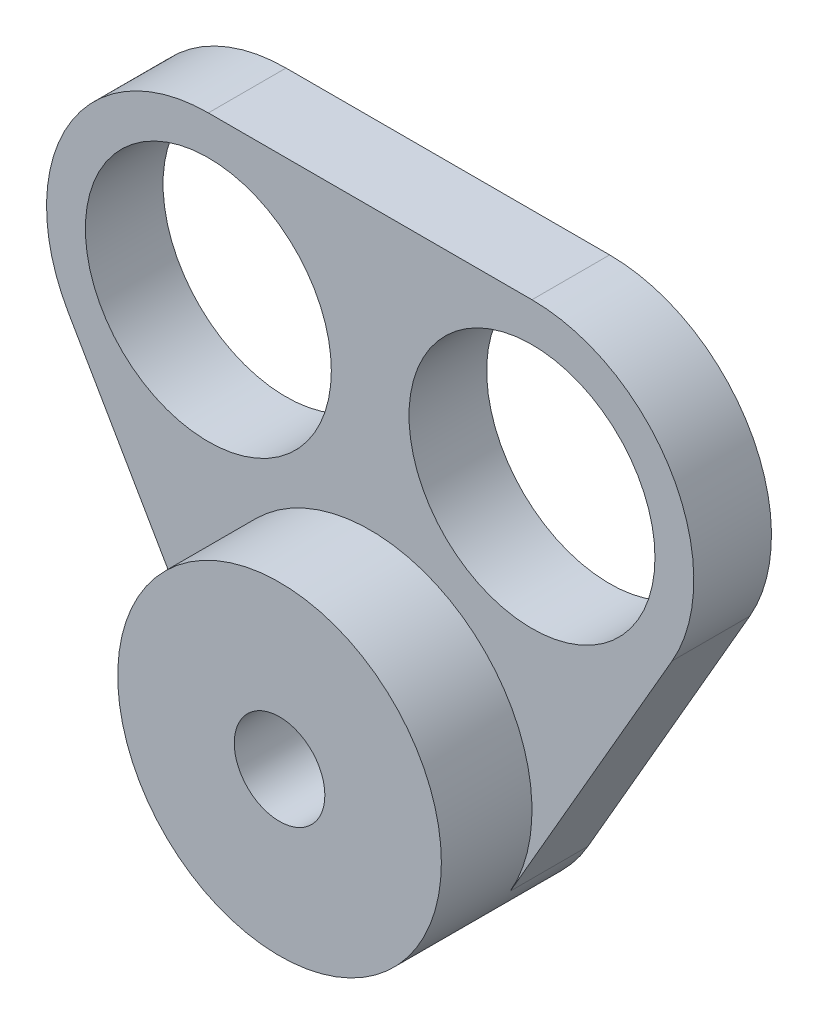
ISO-10303-21;
HEADER;
FILE_DESCRIPTION(('STEP AP214'),'2;1');
FILE_NAME('part.step','',(''),(''),'','','');
FILE_SCHEMA(('AUTOMOTIVE_DESIGN { 1 0 10303 214 1 1 1 1 }'));
ENDSEC;
DATA;
#1=APPLICATION_CONTEXT('core data for automotive mechanical design processes');
#2=APPLICATION_PROTOCOL_DEFINITION('international standard','automotive_design',2000,#1);
#3=PRODUCT_CONTEXT('',#1,'mechanical');
#4=PRODUCT('Part','Part','',(#3));
#5=PRODUCT_RELATED_PRODUCT_CATEGORY('part','',(#4));
#6=PRODUCT_DEFINITION_FORMATION('','',#4);
#7=PRODUCT_DEFINITION_CONTEXT('part definition',#1,'design');
#8=PRODUCT_DEFINITION('design','',#6,#7);
#9=PRODUCT_DEFINITION_SHAPE('','',#8);
#10=(LENGTH_UNIT() NAMED_UNIT(*) SI_UNIT(.MILLI.,.METRE.));
#11=(NAMED_UNIT(*) PLANE_ANGLE_UNIT() SI_UNIT($,.RADIAN.));
#12=(NAMED_UNIT(*) SI_UNIT($,.STERADIAN.) SOLID_ANGLE_UNIT());
#13=UNCERTAINTY_MEASURE_WITH_UNIT(LENGTH_MEASURE(1.E-05),#10,'distance_accuracy_value','');
#14=(GEOMETRIC_REPRESENTATION_CONTEXT(3) GLOBAL_UNCERTAINTY_ASSIGNED_CONTEXT((#13)) GLOBAL_UNIT_ASSIGNED_CONTEXT((#10,
#11,#12)) REPRESENTATION_CONTEXT('',''));
#15=CARTESIAN_POINT('',(0.,0.,0.));
#16=DIRECTION('',(0.,0.,1.));
#17=DIRECTION('',(1.,0.,0.));
#18=AXIS2_PLACEMENT_3D('',#15,#16,#17);
#19=CARTESIAN_POINT('',(0.,0.,6.));
#20=DIRECTION('',(0.,0.,-1.));
#21=DIRECTION('',(-1.,0.,0.));
#22=AXIS2_PLACEMENT_3D('',#19,#20,#21);
#23=CYLINDRICAL_SURFACE('',#22,12.5);
#24=CARTESIAN_POINT('',(0.,0.,0.));
#25=DIRECTION('',(0.,0.,1.));
#26=DIRECTION('',(1.,0.,0.));
#27=AXIS2_PLACEMENT_3D('',#24,#25,#26);
#28=CIRCLE('',#27,12.5);
#29=CARTESIAN_POINT('',(-10.8253175473055,-6.25,0.));
#30=VERTEX_POINT('',#29);
#31=CARTESIAN_POINT('',(10.8253175473055,-6.25,0.));
#32=VERTEX_POINT('',#31);
#33=EDGE_CURVE('E131',#30,#32,#28,.T.);
#34=ORIENTED_EDGE('',*,*,#33,.T.);
#35=DIRECTION('',(0.,0.,-1.));
#36=VECTOR('',#35,1.);
#37=CARTESIAN_POINT('',(10.8253175473055,-6.25,6.));
#38=LINE('',#37,#36);
#39=CARTESIAN_POINT('',(10.8253175473055,-6.25,6.));
#40=VERTEX_POINT('',#39);
#41=EDGE_CURVE('E37',#40,#32,#38,.T.);
#42=ORIENTED_EDGE('',*,*,#41,.F.);
#43=CARTESIAN_POINT('',(0.,0.,6.));
#44=DIRECTION('',(0.,0.,1.));
#45=DIRECTION('',(1.,0.,0.));
#46=AXIS2_PLACEMENT_3D('',#43,#44,#45);
#47=CIRCLE('',#46,12.5);
#48=CARTESIAN_POINT('',(-10.8253175473055,-6.25,6.));
#49=VERTEX_POINT('',#48);
#50=EDGE_CURVE('E11',#40,#49,#47,.T.);
#51=ORIENTED_EDGE('',*,*,#50,.T.);
#52=DIRECTION('',(0.,0.,-1.));
#53=VECTOR('',#52,1.);
#54=CARTESIAN_POINT('',(-10.8253175473055,-6.25,6.));
#55=LINE('',#54,#53);
#56=EDGE_CURVE('E127',#49,#30,#55,.T.);
#57=ORIENTED_EDGE('',*,*,#56,.T.);
#58=EDGE_LOOP('',(#34,#42,#51,#57));
#59=FACE_BOUND('',#58,.T.);
#60=CARTESIAN_POINT('',(0.,0.,13.));
#61=DIRECTION('',(0.,0.,1.));
#62=DIRECTION('',(1.,0.,0.));
#63=AXIS2_PLACEMENT_3D('',#60,#61,#62);
#64=CIRCLE('',#63,12.5);
#65=CARTESIAN_POINT('',(12.5,0.,13.));
#66=VERTEX_POINT('',#65);
#67=EDGE_CURVE('E132',#66,#66,#64,.T.);
#68=ORIENTED_EDGE('',*,*,#67,.F.);
#69=EDGE_LOOP('',(#68));
#70=FACE_BOUND('',#69,.T.);
#71=ADVANCED_FACE('F34',(#59,#70),#23,.T.);
#72=CARTESIAN_POINT('',(10.8253175473055,-6.25,6.));
#73=DIRECTION('',(-0.866025403784439,0.5,0.));
#74=DIRECTION('',(-0.5,-0.866025403784439,0.));
#75=AXIS2_PLACEMENT_3D('',#72,#73,#74);
#76=PLANE('',#75);
#77=DIRECTION('',(0.5,0.866025403784439,0.));
#78=VECTOR('',#77,1.);
#79=CARTESIAN_POINT('',(10.8253175473055,-6.25,0.));
#80=LINE('',#79,#78);
#81=CARTESIAN_POINT('',(23.3253175473055,15.400635094611,0.));
#82=VERTEX_POINT('',#81);
#83=EDGE_CURVE('E135',#32,#82,#80,.T.);
#84=ORIENTED_EDGE('',*,*,#83,.T.);
#85=DIRECTION('',(0.,0.,-1.));
#86=VECTOR('',#85,1.);
#87=CARTESIAN_POINT('',(23.3253175473055,15.400635094611,6.));
#88=LINE('',#87,#86);
#89=CARTESIAN_POINT('',(23.3253175473055,15.400635094611,6.));
#90=VERTEX_POINT('',#89);
#91=EDGE_CURVE('E111',#90,#82,#88,.T.);
#92=ORIENTED_EDGE('',*,*,#91,.F.);
#93=DIRECTION('',(0.5,0.866025403784439,0.));
#94=VECTOR('',#93,1.);
#95=CARTESIAN_POINT('',(10.8253175473055,-6.25,6.));
#96=LINE('',#95,#94);
#97=EDGE_CURVE('E98',#40,#90,#96,.T.);
#98=ORIENTED_EDGE('',*,*,#97,.F.);
#99=ORIENTED_EDGE('',*,*,#41,.T.);
#100=EDGE_LOOP('',(#84,#92,#98,#99));
#101=FACE_BOUND('',#100,.T.);
#102=ADVANCED_FACE('F157',(#101),#76,.F.);
#103=CARTESIAN_POINT('',(12.5,21.650635094611,6.));
#104=DIRECTION('',(0.,0.,-1.));
#105=DIRECTION('',(-1.,0.,0.));
#106=AXIS2_PLACEMENT_3D('',#103,#104,#105);
#107=CYLINDRICAL_SURFACE('',#106,12.5);
#108=CARTESIAN_POINT('',(12.5,21.650635094611,0.));
#109=DIRECTION('',(0.,0.,1.));
#110=DIRECTION('',(1.,0.,0.));
#111=AXIS2_PLACEMENT_3D('',#108,#109,#110);
#112=CIRCLE('',#111,12.5);
#113=CARTESIAN_POINT('',(12.5,34.150635094611,0.));
#114=VERTEX_POINT('',#113);
#115=EDGE_CURVE('E107',#82,#114,#112,.T.);
#116=ORIENTED_EDGE('',*,*,#115,.T.);
#117=DIRECTION('',(0.,0.,-1.));
#118=VECTOR('',#117,1.);
#119=CARTESIAN_POINT('',(12.5,34.150635094611,6.));
#120=LINE('',#119,#118);
#121=CARTESIAN_POINT('',(12.5,34.150635094611,6.));
#122=VERTEX_POINT('',#121);
#123=EDGE_CURVE('E104',#122,#114,#120,.T.);
#124=ORIENTED_EDGE('',*,*,#123,.F.);
#125=CARTESIAN_POINT('',(12.5,21.650635094611,6.));
#126=DIRECTION('',(0.,0.,1.));
#127=DIRECTION('',(1.,0.,0.));
#128=AXIS2_PLACEMENT_3D('',#125,#126,#127);
#129=CIRCLE('',#128,12.5);
#130=EDGE_CURVE('E92',#90,#122,#129,.T.);
#131=ORIENTED_EDGE('',*,*,#130,.F.);
#132=ORIENTED_EDGE('',*,*,#91,.T.);
#133=EDGE_LOOP('',(#116,#124,#131,#132));
#134=FACE_BOUND('',#133,.T.);
#135=ADVANCED_FACE('F105',(#134),#107,.T.);
#136=CARTESIAN_POINT('',(0.,34.150635094611,6.));
#137=DIRECTION('',(0.,1.,0.));
#138=DIRECTION('',(0.,0.,1.));
#139=AXIS2_PLACEMENT_3D('',#136,#137,#138);
#140=PLANE('',#139);
#141=DIRECTION('',(1.,0.,0.));
#142=VECTOR('',#141,1.);
#143=CARTESIAN_POINT('',(0.,34.150635094611,0.));
#144=LINE('',#143,#142);
#145=CARTESIAN_POINT('',(-12.5,34.150635094611,0.));
#146=VERTEX_POINT('',#145);
#147=EDGE_CURVE('E138',#146,#114,#144,.T.);
#148=ORIENTED_EDGE('',*,*,#147,.F.);
#149=DIRECTION('',(0.,0.,-1.));
#150=VECTOR('',#149,1.);
#151=CARTESIAN_POINT('',(-12.5,34.150635094611,6.));
#152=LINE('',#151,#150);
#153=CARTESIAN_POINT('',(-12.5,34.150635094611,6.));
#154=VERTEX_POINT('',#153);
#155=EDGE_CURVE('E112',#154,#146,#152,.T.);
#156=ORIENTED_EDGE('',*,*,#155,.F.);
#157=DIRECTION('',(1.,0.,0.));
#158=VECTOR('',#157,1.);
#159=CARTESIAN_POINT('',(0.,34.150635094611,6.));
#160=LINE('',#159,#158);
#161=EDGE_CURVE('E97',#154,#122,#160,.T.);
#162=ORIENTED_EDGE('',*,*,#161,.T.);
#163=ORIENTED_EDGE('',*,*,#123,.T.);
#164=EDGE_LOOP('',(#148,#156,#162,#163));
#165=FACE_BOUND('',#164,.T.);
#166=ADVANCED_FACE('F114',(#165),#140,.T.);
#167=CARTESIAN_POINT('',(-12.5,21.650635094611,6.));
#168=DIRECTION('',(0.,0.,-1.));
#169=DIRECTION('',(-1.,0.,0.));
#170=AXIS2_PLACEMENT_3D('',#167,#168,#169);
#171=CYLINDRICAL_SURFACE('',#170,12.5);
#172=CARTESIAN_POINT('',(-12.5,21.650635094611,0.));
#173=DIRECTION('',(0.,0.,1.));
#174=DIRECTION('',(1.,0.,0.));
#175=AXIS2_PLACEMENT_3D('',#172,#173,#174);
#176=CIRCLE('',#175,12.5);
#177=CARTESIAN_POINT('',(-23.3253175473055,15.400635094611,0.));
#178=VERTEX_POINT('',#177);
#179=EDGE_CURVE('E74',#146,#178,#176,.T.);
#180=ORIENTED_EDGE('',*,*,#179,.T.);
#181=DIRECTION('',(0.,0.,-1.));
#182=VECTOR('',#181,1.);
#183=CARTESIAN_POINT('',(-23.3253175473055,15.400635094611,6.));
#184=LINE('',#183,#182);
#185=CARTESIAN_POINT('',(-23.3253175473055,15.400635094611,6.));
#186=VERTEX_POINT('',#185);
#187=EDGE_CURVE('E152',#186,#178,#184,.T.);
#188=ORIENTED_EDGE('',*,*,#187,.F.);
#189=CARTESIAN_POINT('',(-12.5,21.650635094611,6.));
#190=DIRECTION('',(0.,0.,1.));
#191=DIRECTION('',(1.,0.,0.));
#192=AXIS2_PLACEMENT_3D('',#189,#190,#191);
#193=CIRCLE('',#192,12.5);
#194=EDGE_CURVE('E51',#154,#186,#193,.T.);
#195=ORIENTED_EDGE('',*,*,#194,.F.);
#196=ORIENTED_EDGE('',*,*,#155,.T.);
#197=EDGE_LOOP('',(#180,#188,#195,#196));
#198=FACE_BOUND('',#197,.T.);
#199=ADVANCED_FACE('F197',(#198),#171,.T.);
#200=CARTESIAN_POINT('',(12.5,21.650635094611,6.));
#201=DIRECTION('',(0.,0.,-1.));
#202=DIRECTION('',(-1.,0.,0.));
#203=AXIS2_PLACEMENT_3D('',#200,#201,#202);
#204=CYLINDRICAL_SURFACE('',#203,9.5);
#205=CARTESIAN_POINT('',(12.5,21.650635094611,6.));
#206=DIRECTION('',(0.,0.,1.));
#207=DIRECTION('',(1.,0.,0.));
#208=AXIS2_PLACEMENT_3D('',#205,#206,#207);
#209=CIRCLE('',#208,9.5);
#210=CARTESIAN_POINT('',(22.,21.650635094611,6.));
#211=VERTEX_POINT('',#210);
#212=EDGE_CURVE('E124',#211,#211,#209,.T.);
#213=ORIENTED_EDGE('',*,*,#212,.T.);
#214=EDGE_LOOP('',(#213));
#215=FACE_BOUND('',#214,.T.);
#216=CARTESIAN_POINT('',(12.5,21.650635094611,0.));
#217=DIRECTION('',(0.,0.,1.));
#218=DIRECTION('',(1.,0.,0.));
#219=AXIS2_PLACEMENT_3D('',#216,#217,#218);
#220=CIRCLE('',#219,9.5);
#221=CARTESIAN_POINT('',(22.,21.650635094611,0.));
#222=VERTEX_POINT('',#221);
#223=EDGE_CURVE('E145',#222,#222,#220,.T.);
#224=ORIENTED_EDGE('',*,*,#223,.F.);
#225=EDGE_LOOP('',(#224));
#226=FACE_BOUND('',#225,.T.);
#227=ADVANCED_FACE('F199',(#215,#226),#204,.F.);
#228=CARTESIAN_POINT('',(-12.5,21.650635094611,6.));
#229=DIRECTION('',(0.,0.,-1.));
#230=DIRECTION('',(-1.,0.,0.));
#231=AXIS2_PLACEMENT_3D('',#228,#229,#230);
#232=CYLINDRICAL_SURFACE('',#231,9.5);
#233=CARTESIAN_POINT('',(-12.5,21.650635094611,6.));
#234=DIRECTION('',(0.,0.,1.));
#235=DIRECTION('',(1.,0.,0.));
#236=AXIS2_PLACEMENT_3D('',#233,#234,#235);
#237=CIRCLE('',#236,9.5);
#238=CARTESIAN_POINT('',(-3.,21.650635094611,6.));
#239=VERTEX_POINT('',#238);
#240=EDGE_CURVE('E121',#239,#239,#237,.T.);
#241=ORIENTED_EDGE('',*,*,#240,.T.);
#242=EDGE_LOOP('',(#241));
#243=FACE_BOUND('',#242,.T.);
#244=CARTESIAN_POINT('',(-12.5,21.650635094611,0.));
#245=DIRECTION('',(0.,0.,1.));
#246=DIRECTION('',(1.,0.,0.));
#247=AXIS2_PLACEMENT_3D('',#244,#245,#246);
#248=CIRCLE('',#247,9.5);
#249=CARTESIAN_POINT('',(-3.,21.650635094611,0.));
#250=VERTEX_POINT('',#249);
#251=EDGE_CURVE('E142',#250,#250,#248,.T.);
#252=ORIENTED_EDGE('',*,*,#251,.F.);
#253=EDGE_LOOP('',(#252));
#254=FACE_BOUND('',#253,.T.);
#255=ADVANCED_FACE('F183',(#243,#254),#232,.F.);
#256=CARTESIAN_POINT('',(-10.8253175473055,-6.25,6.));
#257=DIRECTION('',(0.866025403784438,0.5,0.));
#258=DIRECTION('',(-0.5,0.866025403784439,0.));
#259=AXIS2_PLACEMENT_3D('',#256,#257,#258);
#260=PLANE('',#259);
#261=DIRECTION('',(0.5,-0.866025403784439,0.));
#262=VECTOR('',#261,1.);
#263=CARTESIAN_POINT('',(-10.8253175473055,-6.25,0.));
#264=LINE('',#263,#262);
#265=EDGE_CURVE('E81',#178,#30,#264,.T.);
#266=ORIENTED_EDGE('',*,*,#265,.T.);
#267=ORIENTED_EDGE('',*,*,#56,.F.);
#268=DIRECTION('',(0.5,-0.866025403784439,0.));
#269=VECTOR('',#268,1.);
#270=CARTESIAN_POINT('',(-10.8253175473055,-6.25,6.));
#271=LINE('',#270,#269);
#272=EDGE_CURVE('E116',#186,#49,#271,.T.);
#273=ORIENTED_EDGE('',*,*,#272,.F.);
#274=ORIENTED_EDGE('',*,*,#187,.T.);
#275=EDGE_LOOP('',(#266,#267,#273,#274));
#276=FACE_BOUND('',#275,.T.);
#277=ADVANCED_FACE('F175',(#276),#260,.F.);
#278=CARTESIAN_POINT('',(0.,0.,6.));
#279=DIRECTION('',(0.,0.,-1.));
#280=DIRECTION('',(-1.,0.,0.));
#281=AXIS2_PLACEMENT_3D('',#278,#279,#280);
#282=CYLINDRICAL_SURFACE('',#281,9.5);
#283=CARTESIAN_POINT('',(0.,0.,6.));
#284=DIRECTION('',(0.,0.,1.));
#285=DIRECTION('',(1.,0.,0.));
#286=AXIS2_PLACEMENT_3D('',#283,#284,#285);
#287=CIRCLE('',#286,9.5);
#288=CARTESIAN_POINT('',(9.5,0.,6.));
#289=VERTEX_POINT('',#288);
#290=EDGE_CURVE('E128',#289,#289,#287,.T.);
#291=ORIENTED_EDGE('',*,*,#290,.T.);
#292=EDGE_LOOP('',(#291));
#293=FACE_BOUND('',#292,.T.);
#294=CARTESIAN_POINT('',(0.,0.,0.));
#295=DIRECTION('',(0.,0.,1.));
#296=DIRECTION('',(1.,0.,0.));
#297=AXIS2_PLACEMENT_3D('',#294,#295,#296);
#298=CIRCLE('',#297,9.5);
#299=CARTESIAN_POINT('',(9.5,0.,0.));
#300=VERTEX_POINT('',#299);
#301=EDGE_CURVE('E148',#300,#300,#298,.T.);
#302=ORIENTED_EDGE('',*,*,#301,.F.);
#303=EDGE_LOOP('',(#302));
#304=FACE_BOUND('',#303,.T.);
#305=ADVANCED_FACE('F173',(#293,#304),#282,.F.);
#306=CARTESIAN_POINT('',(0.,0.,6.));
#307=DIRECTION('',(0.,0.,1.));
#308=DIRECTION('',(1.,0.,0.));
#309=AXIS2_PLACEMENT_3D('',#306,#307,#308);
#310=PLANE('',#309);
#311=ORIENTED_EDGE('',*,*,#50,.F.);
#312=ORIENTED_EDGE('',*,*,#97,.T.);
#313=ORIENTED_EDGE('',*,*,#130,.T.);
#314=ORIENTED_EDGE('',*,*,#161,.F.);
#315=ORIENTED_EDGE('',*,*,#194,.T.);
#316=ORIENTED_EDGE('',*,*,#272,.T.);
#317=EDGE_LOOP('',(#311,#312,#313,#314,#315,#316));
#318=FACE_BOUND('',#317,.T.);
#319=ORIENTED_EDGE('',*,*,#240,.F.);
#320=EDGE_LOOP('',(#319));
#321=FACE_BOUND('',#320,.T.);
#322=ORIENTED_EDGE('',*,*,#212,.F.);
#323=EDGE_LOOP('',(#322));
#324=FACE_BOUND('',#323,.T.);
#325=ADVANCED_FACE('F94',(#318,#321,#324),#310,.T.);
#326=CARTESIAN_POINT('',(0.,0.,0.));
#327=DIRECTION('',(0.,0.,1.));
#328=DIRECTION('',(1.,0.,0.));
#329=AXIS2_PLACEMENT_3D('',#326,#327,#328);
#330=PLANE('',#329);
#331=ORIENTED_EDGE('',*,*,#33,.F.);
#332=ORIENTED_EDGE('',*,*,#265,.F.);
#333=ORIENTED_EDGE('',*,*,#179,.F.);
#334=ORIENTED_EDGE('',*,*,#147,.T.);
#335=ORIENTED_EDGE('',*,*,#115,.F.);
#336=ORIENTED_EDGE('',*,*,#83,.F.);
#337=EDGE_LOOP('',(#331,#332,#333,#334,#335,#336));
#338=FACE_BOUND('',#337,.T.);
#339=ORIENTED_EDGE('',*,*,#251,.T.);
#340=EDGE_LOOP('',(#339));
#341=FACE_BOUND('',#340,.T.);
#342=ORIENTED_EDGE('',*,*,#223,.T.);
#343=EDGE_LOOP('',(#342));
#344=FACE_BOUND('',#343,.T.);
#345=ORIENTED_EDGE('',*,*,#301,.T.);
#346=EDGE_LOOP('',(#345));
#347=FACE_BOUND('',#346,.T.);
#348=ADVANCED_FACE('F162',(#338,#341,#344,#347),#330,.F.);
#349=CARTESIAN_POINT('',(0.,0.,13.));
#350=DIRECTION('',(0.,0.,1.));
#351=DIRECTION('',(1.,0.,0.));
#352=AXIS2_PLACEMENT_3D('',#349,#350,#351);
#353=PLANE('',#352);
#354=ORIENTED_EDGE('',*,*,#67,.T.);
#355=EDGE_LOOP('',(#354));
#356=FACE_BOUND('',#355,.T.);
#357=CARTESIAN_POINT('',(0.,0.,13.));
#358=DIRECTION('',(0.,0.,1.));
#359=DIRECTION('',(1.,0.,0.));
#360=AXIS2_PLACEMENT_3D('',#357,#358,#359);
#361=CIRCLE('',#360,3.5);
#362=CARTESIAN_POINT('',(3.5,0.,13.));
#363=VERTEX_POINT('',#362);
#364=EDGE_CURVE('E286',#363,#363,#361,.T.);
#365=ORIENTED_EDGE('',*,*,#364,.F.);
#366=EDGE_LOOP('',(#365));
#367=FACE_BOUND('',#366,.T.);
#368=ADVANCED_FACE('F165',(#356,#367),#353,.T.);
#369=CARTESIAN_POINT('',(0.,0.,6.));
#370=DIRECTION('',(0.,0.,1.));
#371=DIRECTION('',(1.,0.,0.));
#372=AXIS2_PLACEMENT_3D('',#369,#370,#371);
#373=PLANE('',#372);
#374=ORIENTED_EDGE('',*,*,#290,.F.);
#375=EDGE_LOOP('',(#374));
#376=FACE_BOUND('',#375,.T.);
#377=CARTESIAN_POINT('',(0.,0.,6.));
#378=DIRECTION('',(0.,0.,1.));
#379=DIRECTION('',(1.,0.,0.));
#380=AXIS2_PLACEMENT_3D('',#377,#378,#379);
#381=CIRCLE('',#380,3.5);
#382=CARTESIAN_POINT('',(3.5,0.,6.));
#383=VERTEX_POINT('',#382);
#384=EDGE_CURVE('E289',#383,#383,#381,.T.);
#385=ORIENTED_EDGE('',*,*,#384,.T.);
#386=EDGE_LOOP('',(#385));
#387=FACE_BOUND('',#386,.T.);
#388=ADVANCED_FACE('F259',(#376,#387),#373,.F.);
#389=CARTESIAN_POINT('',(0.,0.,13.));
#390=DIRECTION('',(0.,0.,-1.));
#391=DIRECTION('',(-1.,0.,0.));
#392=AXIS2_PLACEMENT_3D('',#389,#390,#391);
#393=CYLINDRICAL_SURFACE('',#392,3.5);
#394=ORIENTED_EDGE('',*,*,#364,.T.);
#395=EDGE_LOOP('',(#394));
#396=FACE_BOUND('',#395,.T.);
#397=ORIENTED_EDGE('',*,*,#384,.F.);
#398=EDGE_LOOP('',(#397));
#399=FACE_BOUND('',#398,.T.);
#400=ADVANCED_FACE('F269',(#396,#399),#393,.F.);
#401=CLOSED_SHELL('',(#71,#102,#135,#166,#199,#227,#255,#277,#305,#325,#348,#368,#388,#400));
#402=MANIFOLD_SOLID_BREP('B2',#401);
#403=ADVANCED_BREP_SHAPE_REPRESENTATION('',(#18,#402),#14);
#404=SHAPE_DEFINITION_REPRESENTATION(#9,#403);
ENDSEC;
END-ISO-10303-21;
